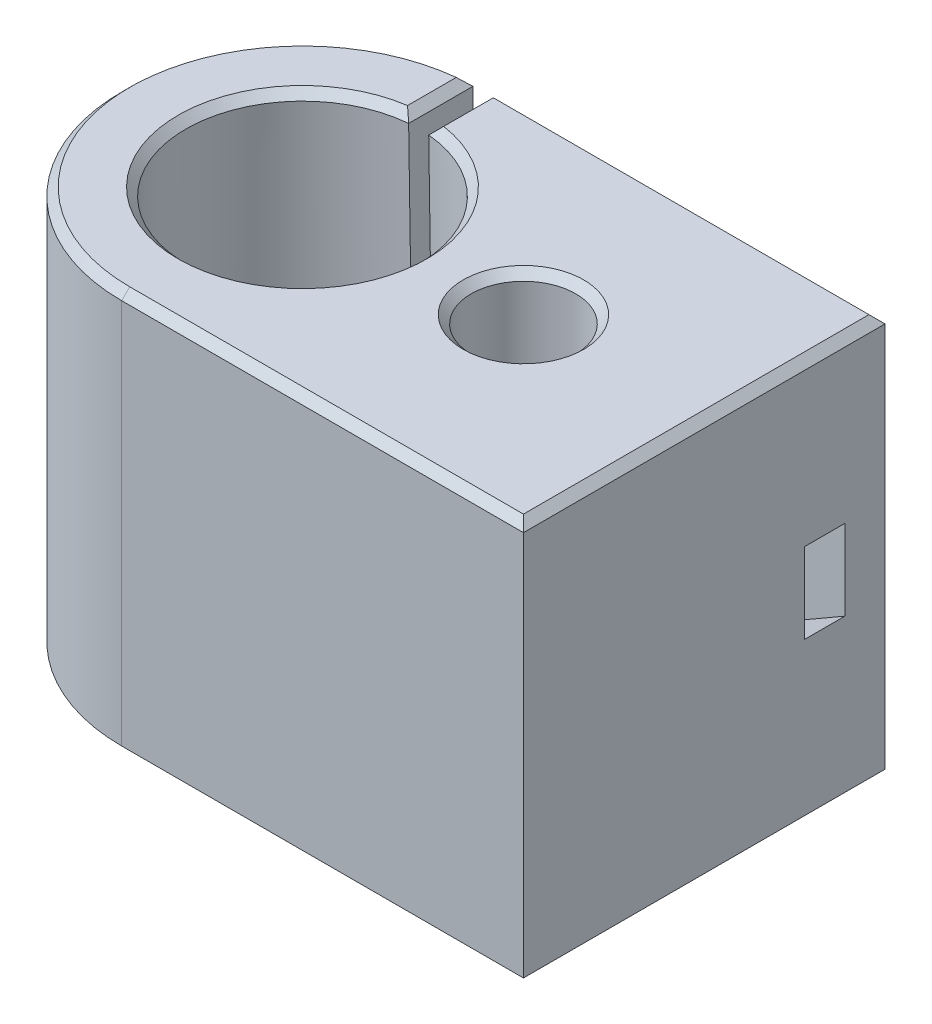
ISO-10303-21;
HEADER;
FILE_DESCRIPTION(('STEP AP214'),'2;1');
FILE_NAME('part.step','',(''),(''),'','','');
FILE_SCHEMA(('AUTOMOTIVE_DESIGN { 1 0 10303 214 1 1 1 1 }'));
ENDSEC;
DATA;
#1=APPLICATION_CONTEXT('core data for automotive mechanical design processes');
#2=APPLICATION_PROTOCOL_DEFINITION('international standard','automotive_design',2000,#1);
#3=PRODUCT_CONTEXT('',#1,'mechanical');
#4=PRODUCT('Part','Part','',(#3));
#5=PRODUCT_RELATED_PRODUCT_CATEGORY('part','',(#4));
#6=PRODUCT_DEFINITION_FORMATION('','',#4);
#7=PRODUCT_DEFINITION_CONTEXT('part definition',#1,'design');
#8=PRODUCT_DEFINITION('design','',#6,#7);
#9=PRODUCT_DEFINITION_SHAPE('','',#8);
#10=(LENGTH_UNIT() NAMED_UNIT(*) SI_UNIT(.MILLI.,.METRE.));
#11=(NAMED_UNIT(*) PLANE_ANGLE_UNIT() SI_UNIT($,.RADIAN.));
#12=(NAMED_UNIT(*) SI_UNIT($,.STERADIAN.) SOLID_ANGLE_UNIT());
#13=UNCERTAINTY_MEASURE_WITH_UNIT(LENGTH_MEASURE(1.E-05),#10,'distance_accuracy_value','');
#14=(GEOMETRIC_REPRESENTATION_CONTEXT(3) GLOBAL_UNCERTAINTY_ASSIGNED_CONTEXT((#13)) GLOBAL_UNIT_ASSIGNED_CONTEXT((#10,
#11,#12)) REPRESENTATION_CONTEXT('',''));
#15=CARTESIAN_POINT('',(0.,0.,0.));
#16=DIRECTION('',(0.,0.,1.));
#17=DIRECTION('',(1.,0.,0.));
#18=AXIS2_PLACEMENT_3D('',#15,#16,#17);
#19=CARTESIAN_POINT('',(0.,20.,0.));
#20=DIRECTION('',(0.,-1.,0.));
#21=DIRECTION('',(0.,0.,-1.));
#22=AXIS2_PLACEMENT_3D('',#19,#20,#21);
#23=CYLINDRICAL_SURFACE('',#22,9.);
#24=DIRECTION('',(0.,-1.,0.));
#25=VECTOR('',#24,1.);
#26=CARTESIAN_POINT('',(-0.5,20.,-8.98610037780572));
#27=LINE('',#26,#25);
#28=CARTESIAN_POINT('',(-0.5,19.6,-8.98610037780572));
#29=VERTEX_POINT('',#28);
#30=CARTESIAN_POINT('',(-0.5,0.400000000000005,-8.98610037780572));
#31=VERTEX_POINT('',#30);
#32=EDGE_CURVE('E208',#29,#31,#27,.T.);
#33=ORIENTED_EDGE('',*,*,#32,.T.);
#34=CARTESIAN_POINT('',(0.,0.400000000000005,0.));
#35=DIRECTION('',(0.,1.,0.));
#36=DIRECTION('',(0.,0.,1.));
#37=AXIS2_PLACEMENT_3D('',#34,#35,#36);
#38=CIRCLE('',#37,9.);
#39=CARTESIAN_POINT('',(0.,0.400000000000005,9.00000000000001));
#40=VERTEX_POINT('',#39);
#41=EDGE_CURVE('E497',#31,#40,#38,.T.);
#42=ORIENTED_EDGE('',*,*,#41,.T.);
#43=DIRECTION('',(0.,-1.,0.));
#44=VECTOR('',#43,1.);
#45=CARTESIAN_POINT('',(0.,20.,9.00000000000001));
#46=LINE('',#45,#44);
#47=CARTESIAN_POINT('',(0.,19.6,9.00000000000001));
#48=VERTEX_POINT('',#47);
#49=EDGE_CURVE('E218',#48,#40,#46,.T.);
#50=ORIENTED_EDGE('',*,*,#49,.F.);
#51=CARTESIAN_POINT('',(0.,19.6,0.));
#52=DIRECTION('',(0.,1.,0.));
#53=DIRECTION('',(0.,0.,1.));
#54=AXIS2_PLACEMENT_3D('',#51,#52,#53);
#55=CIRCLE('',#54,9.);
#56=EDGE_CURVE('E487',#48,#29,#55,.F.);
#57=ORIENTED_EDGE('',*,*,#56,.T.);
#58=EDGE_LOOP('',(#33,#42,#50,#57));
#59=FACE_BOUND('',#58,.T.);
#60=ADVANCED_FACE('F35',(#59),#23,.T.);
#61=CARTESIAN_POINT('',(20.,20.,9.));
#62=DIRECTION('',(0.,0.,-1.));
#63=DIRECTION('',(-1.,0.,0.));
#64=AXIS2_PLACEMENT_3D('',#61,#62,#63);
#65=PLANE('',#64);
#66=ORIENTED_EDGE('',*,*,#49,.T.);
#67=DIRECTION('',(1.,0.,0.));
#68=VECTOR('',#67,1.);
#69=CARTESIAN_POINT('',(20.,0.400000000000005,9.));
#70=LINE('',#69,#68);
#71=CARTESIAN_POINT('',(20.,0.400000000000005,9.));
#72=VERTEX_POINT('',#71);
#73=EDGE_CURVE('E506',#40,#72,#70,.T.);
#74=ORIENTED_EDGE('',*,*,#73,.T.);
#75=DIRECTION('',(0.,-1.,0.));
#76=VECTOR('',#75,1.);
#77=CARTESIAN_POINT('',(20.,20.,9.));
#78=LINE('',#77,#76);
#79=CARTESIAN_POINT('',(20.,19.6,9.));
#80=VERTEX_POINT('',#79);
#81=EDGE_CURVE('E215',#80,#72,#78,.T.);
#82=ORIENTED_EDGE('',*,*,#81,.F.);
#83=DIRECTION('',(-1.,0.,0.));
#84=VECTOR('',#83,1.);
#85=CARTESIAN_POINT('',(0.,19.6,9.00000000000001));
#86=LINE('',#85,#84);
#87=EDGE_CURVE('E489',#80,#48,#86,.T.);
#88=ORIENTED_EDGE('',*,*,#87,.T.);
#89=EDGE_LOOP('',(#66,#74,#82,#88));
#90=FACE_BOUND('',#89,.T.);
#91=ADVANCED_FACE('F428',(#90),#65,.F.);
#92=CARTESIAN_POINT('',(20.,20.,-9.));
#93=DIRECTION('',(-1.,0.,0.));
#94=DIRECTION('',(0.,0.,1.));
#95=AXIS2_PLACEMENT_3D('',#92,#93,#94);
#96=PLANE('',#95);
#97=DIRECTION('',(0.,0.,-1.));
#98=VECTOR('',#97,1.);
#99=CARTESIAN_POINT('',(20.,8.,-5.));
#100=LINE('',#99,#98);
#101=CARTESIAN_POINT('',(20.,8.,-5.));
#102=VERTEX_POINT('',#101);
#103=CARTESIAN_POINT('',(20.,8.,-7.));
#104=VERTEX_POINT('',#103);
#105=EDGE_CURVE('E178',#102,#104,#100,.T.);
#106=ORIENTED_EDGE('',*,*,#105,.F.);
#107=DIRECTION('',(0.,-1.,0.));
#108=VECTOR('',#107,1.);
#109=CARTESIAN_POINT('',(20.,12.,-5.));
#110=LINE('',#109,#108);
#111=CARTESIAN_POINT('',(20.,12.,-5.));
#112=VERTEX_POINT('',#111);
#113=EDGE_CURVE('E185',#112,#102,#110,.T.);
#114=ORIENTED_EDGE('',*,*,#113,.F.);
#115=DIRECTION('',(0.,0.,-1.));
#116=VECTOR('',#115,1.);
#117=CARTESIAN_POINT('',(20.,12.,-5.));
#118=LINE('',#117,#116);
#119=CARTESIAN_POINT('',(20.,12.,-7.));
#120=VERTEX_POINT('',#119);
#121=EDGE_CURVE('E209',#112,#120,#118,.T.);
#122=ORIENTED_EDGE('',*,*,#121,.T.);
#123=DIRECTION('',(0.,-1.,0.));
#124=VECTOR('',#123,1.);
#125=CARTESIAN_POINT('',(20.,12.,-7.));
#126=LINE('',#125,#124);
#127=EDGE_CURVE('E198',#120,#104,#126,.T.);
#128=ORIENTED_EDGE('',*,*,#127,.T.);
#129=EDGE_LOOP('',(#106,#114,#122,#128));
#130=FACE_BOUND('',#129,.T.);
#131=ORIENTED_EDGE('',*,*,#81,.T.);
#132=DIRECTION('',(0.,0.,-1.));
#133=VECTOR('',#132,1.);
#134=CARTESIAN_POINT('',(20.,0.400000000000005,-9.));
#135=LINE('',#134,#133);
#136=CARTESIAN_POINT('',(20.,0.400000000000005,-9.));
#137=VERTEX_POINT('',#136);
#138=EDGE_CURVE('E511',#72,#137,#135,.T.);
#139=ORIENTED_EDGE('',*,*,#138,.T.);
#140=DIRECTION('',(0.,-1.,0.));
#141=VECTOR('',#140,1.);
#142=CARTESIAN_POINT('',(20.,20.,-9.));
#143=LINE('',#142,#141);
#144=CARTESIAN_POINT('',(20.,19.6,-9.));
#145=VERTEX_POINT('',#144);
#146=EDGE_CURVE('E212',#145,#137,#143,.T.);
#147=ORIENTED_EDGE('',*,*,#146,.F.);
#148=DIRECTION('',(0.,0.,1.));
#149=VECTOR('',#148,1.);
#150=CARTESIAN_POINT('',(20.,19.6,9.));
#151=LINE('',#150,#149);
#152=EDGE_CURVE('E476',#145,#80,#151,.T.);
#153=ORIENTED_EDGE('',*,*,#152,.T.);
#154=EDGE_LOOP('',(#131,#139,#147,#153));
#155=FACE_BOUND('',#154,.T.);
#156=ADVANCED_FACE('F196',(#130,#155),#96,.F.);
#157=CARTESIAN_POINT('',(0.,20.,-9.));
#158=DIRECTION('',(0.,0.,1.));
#159=DIRECTION('',(1.,0.,0.));
#160=AXIS2_PLACEMENT_3D('',#157,#158,#159);
#161=PLANE('',#160);
#162=ORIENTED_EDGE('',*,*,#146,.T.);
#163=DIRECTION('',(-1.,0.,0.));
#164=VECTOR('',#163,1.);
#165=CARTESIAN_POINT('',(0.,0.400000000000005,-9.));
#166=LINE('',#165,#164);
#167=CARTESIAN_POINT('',(0.5,0.400000000000001,-9.));
#168=VERTEX_POINT('',#167);
#169=EDGE_CURVE('E513',#137,#168,#166,.T.);
#170=ORIENTED_EDGE('',*,*,#169,.T.);
#171=DIRECTION('',(0.,1.,0.));
#172=VECTOR('',#171,1.);
#173=CARTESIAN_POINT('',(0.5,-9.05538513813741,-9.));
#174=LINE('',#173,#172);
#175=CARTESIAN_POINT('',(0.5,19.6,-9.));
#176=VERTEX_POINT('',#175);
#177=EDGE_CURVE('E205',#168,#176,#174,.T.);
#178=ORIENTED_EDGE('',*,*,#177,.T.);
#179=DIRECTION('',(1.,0.,0.));
#180=VECTOR('',#179,1.);
#181=CARTESIAN_POINT('',(20.,19.6,-9.));
#182=LINE('',#181,#180);
#183=EDGE_CURVE('E258',#176,#145,#182,.T.);
#184=ORIENTED_EDGE('',*,*,#183,.T.);
#185=EDGE_LOOP('',(#162,#170,#178,#184));
#186=FACE_BOUND('',#185,.T.);
#187=ADVANCED_FACE('F438',(#186),#161,.F.);
#188=CARTESIAN_POINT('',(0.,20.,0.));
#189=DIRECTION('',(0.,1.,0.));
#190=DIRECTION('',(0.,0.,1.));
#191=AXIS2_PLACEMENT_3D('',#188,#189,#190);
#192=PLANE('',#191);
#193=DIRECTION('',(0.,0.,1.));
#194=VECTOR('',#193,1.);
#195=CARTESIAN_POINT('',(0.900000000000004,20.,-5.77840808527747));
#196=LINE('',#195,#194);
#197=CARTESIAN_POINT('',(0.900000000000004,20.,-8.6));
#198=VERTEX_POINT('',#197);
#199=CARTESIAN_POINT('',(0.900000000000004,20.,-6.12839976272959));
#200=VERTEX_POINT('',#199);
#201=EDGE_CURVE('E45',#198,#200,#196,.T.);
#202=ORIENTED_EDGE('',*,*,#201,.T.);
#203=CARTESIAN_POINT('',(0.,20.,0.));
#204=DIRECTION('',(0.,1.,0.));
#205=DIRECTION('',(0.,0.,1.));
#206=AXIS2_PLACEMENT_3D('',#203,#204,#205);
#207=CIRCLE('',#206,6.19413300243255);
#208=CARTESIAN_POINT('',(-0.900000000000004,20.,-6.12839976272959));
#209=VERTEX_POINT('',#208);
#210=EDGE_CURVE('E11',#200,#209,#207,.F.);
#211=ORIENTED_EDGE('',*,*,#210,.T.);
#212=DIRECTION('',(0.,0.,-1.));
#213=VECTOR('',#212,1.);
#214=CARTESIAN_POINT('',(-0.900000000000004,20.,-8.98610037780572));
#215=LINE('',#214,#213);
#216=CARTESIAN_POINT('',(-0.900000000000004,20.,-8.55277732669336));
#217=VERTEX_POINT('',#216);
#218=EDGE_CURVE('E363',#209,#217,#215,.T.);
#219=ORIENTED_EDGE('',*,*,#218,.T.);
#220=CARTESIAN_POINT('',(0.,20.,0.));
#221=DIRECTION('',(0.,1.,0.));
#222=DIRECTION('',(0.,0.,1.));
#223=AXIS2_PLACEMENT_3D('',#220,#221,#222);
#224=CIRCLE('',#223,8.6);
#225=CARTESIAN_POINT('',(0.,20.,8.6));
#226=VERTEX_POINT('',#225);
#227=EDGE_CURVE('E456',#217,#226,#224,.T.);
#228=ORIENTED_EDGE('',*,*,#227,.T.);
#229=DIRECTION('',(1.,0.,0.));
#230=VECTOR('',#229,1.);
#231=CARTESIAN_POINT('',(20.,20.,8.59999999999999));
#232=LINE('',#231,#230);
#233=CARTESIAN_POINT('',(19.6,20.,8.59999999999999));
#234=VERTEX_POINT('',#233);
#235=EDGE_CURVE('E464',#226,#234,#232,.T.);
#236=ORIENTED_EDGE('',*,*,#235,.T.);
#237=DIRECTION('',(0.,0.,-1.));
#238=VECTOR('',#237,1.);
#239=CARTESIAN_POINT('',(19.6,20.,-9.));
#240=LINE('',#239,#238);
#241=CARTESIAN_POINT('',(19.6,20.,-8.59999999999999));
#242=VERTEX_POINT('',#241);
#243=EDGE_CURVE('E466',#234,#242,#240,.T.);
#244=ORIENTED_EDGE('',*,*,#243,.T.);
#245=DIRECTION('',(-1.,0.,0.));
#246=VECTOR('',#245,1.);
#247=CARTESIAN_POINT('',(0.5,20.,-8.6));
#248=LINE('',#247,#246);
#249=EDGE_CURVE('E56',#242,#198,#248,.T.);
#250=ORIENTED_EDGE('',*,*,#249,.T.);
#251=EDGE_LOOP('',(#202,#211,#219,#228,#236,#244,#250));
#252=FACE_BOUND('',#251,.T.);
#253=CARTESIAN_POINT('',(11.,20.,0.));
#254=DIRECTION('',(0.,1.,0.));
#255=DIRECTION('',(0.,0.,1.));
#256=AXIS2_PLACEMENT_3D('',#253,#254,#255);
#257=CIRCLE('',#256,3.);
#258=CARTESIAN_POINT('',(11.,20.,3.));
#259=VERTEX_POINT('',#258);
#260=EDGE_CURVE('E452',#259,#259,#257,.F.);
#261=ORIENTED_EDGE('',*,*,#260,.T.);
#262=EDGE_LOOP('',(#261));
#263=FACE_BOUND('',#262,.T.);
#264=ADVANCED_FACE('F441',(#252,#263),#192,.T.);
#265=CARTESIAN_POINT('',(0.,0.,0.));
#266=DIRECTION('',(0.,1.,0.));
#267=DIRECTION('',(0.,0.,1.));
#268=AXIS2_PLACEMENT_3D('',#265,#266,#267);
#269=PLANE('',#268);
#270=DIRECTION('',(0.,0.,1.));
#271=VECTOR('',#270,1.);
#272=CARTESIAN_POINT('',(-0.900000000000005,0.,0.));
#273=LINE('',#272,#271);
#274=CARTESIAN_POINT('',(-0.900000000000006,0.,-8.55277732669335));
#275=VERTEX_POINT('',#274);
#276=CARTESIAN_POINT('',(-0.900000000000005,0.,-6.43739077577248));
#277=VERTEX_POINT('',#276);
#278=EDGE_CURVE('E311',#275,#277,#273,.T.);
#279=ORIENTED_EDGE('',*,*,#278,.T.);
#280=CARTESIAN_POINT('',(0.,0.,0.));
#281=DIRECTION('',(0.,1.,0.));
#282=DIRECTION('',(0.,0.,1.));
#283=AXIS2_PLACEMENT_3D('',#280,#281,#282);
#284=CIRCLE('',#283,6.50000000000009);
#285=CARTESIAN_POINT('',(0.900000000000005,0.,-6.43739077577248));
#286=VERTEX_POINT('',#285);
#287=EDGE_CURVE('E321',#277,#286,#284,.T.);
#288=ORIENTED_EDGE('',*,*,#287,.T.);
#289=DIRECTION('',(0.,0.,-1.));
#290=VECTOR('',#289,1.);
#291=CARTESIAN_POINT('',(0.900000000000005,0.,0.));
#292=LINE('',#291,#290);
#293=CARTESIAN_POINT('',(0.900000000000006,0.,-8.59999999999999));
#294=VERTEX_POINT('',#293);
#295=EDGE_CURVE('E319',#286,#294,#292,.T.);
#296=ORIENTED_EDGE('',*,*,#295,.T.);
#297=DIRECTION('',(1.,0.,0.));
#298=VECTOR('',#297,1.);
#299=CARTESIAN_POINT('',(0.,0.,-8.59999999999999));
#300=LINE('',#299,#298);
#301=CARTESIAN_POINT('',(19.6,0.,-8.59999999999999));
#302=VERTEX_POINT('',#301);
#303=EDGE_CURVE('E317',#294,#302,#300,.T.);
#304=ORIENTED_EDGE('',*,*,#303,.T.);
#305=DIRECTION('',(0.,0.,1.));
#306=VECTOR('',#305,1.);
#307=CARTESIAN_POINT('',(19.6,0.,0.));
#308=LINE('',#307,#306);
#309=CARTESIAN_POINT('',(19.6,0.,8.59999999999999));
#310=VERTEX_POINT('',#309);
#311=EDGE_CURVE('E315',#302,#310,#308,.T.);
#312=ORIENTED_EDGE('',*,*,#311,.T.);
#313=DIRECTION('',(-1.,0.,0.));
#314=VECTOR('',#313,1.);
#315=CARTESIAN_POINT('',(0.,0.,8.6));
#316=LINE('',#315,#314);
#317=CARTESIAN_POINT('',(0.,0.,8.6));
#318=VERTEX_POINT('',#317);
#319=EDGE_CURVE('E313',#310,#318,#316,.T.);
#320=ORIENTED_EDGE('',*,*,#319,.T.);
#321=CARTESIAN_POINT('',(0.,0.,0.));
#322=DIRECTION('',(0.,1.,0.));
#323=DIRECTION('',(0.,0.,1.));
#324=AXIS2_PLACEMENT_3D('',#321,#322,#323);
#325=CIRCLE('',#324,8.6);
#326=EDGE_CURVE('E309',#318,#275,#325,.F.);
#327=ORIENTED_EDGE('',*,*,#326,.T.);
#328=EDGE_LOOP('',(#279,#288,#296,#304,#312,#320,#327));
#329=FACE_BOUND('',#328,.T.);
#330=CARTESIAN_POINT('',(11.,0.,0.));
#331=DIRECTION('',(0.,1.,0.));
#332=DIRECTION('',(0.,0.,1.));
#333=AXIS2_PLACEMENT_3D('',#330,#331,#332);
#334=CIRCLE('',#333,3.00000000000001);
#335=CARTESIAN_POINT('',(11.,0.,3.00000000000001));
#336=VERTEX_POINT('',#335);
#337=EDGE_CURVE('E304',#336,#336,#334,.T.);
#338=ORIENTED_EDGE('',*,*,#337,.T.);
#339=EDGE_LOOP('',(#338));
#340=FACE_BOUND('',#339,.T.);
#341=ADVANCED_FACE('F443',(#329,#340),#269,.F.);
#342=CARTESIAN_POINT('',(0.,20.,0.));
#343=DIRECTION('',(0.,-1.,0.));
#344=DIRECTION('',(1.,0.,0.));
#345=AXIS2_PLACEMENT_3D('',#342,#343,#344);
#346=CONICAL_SURFACE('',#345,5.8,0.0149988751518525);
#347=CARTESIAN_POINT('',(0.5,-20.9097671882514,-6.39412711222737));
#348=CARTESIAN_POINT('',(0.5,-16.6976612000782,-6.330753652525));
#349=CARTESIAN_POINT('',(0.5,-12.4855553158357,-6.26737328767739));
#350=CARTESIAN_POINT('',(0.5,8.12095761354692,-5.95726934756004));
#351=CARTESIAN_POINT('',(0.5,24.5153631881387,-5.71044806923976));
#352=CARTESIAN_POINT('',(0.5,40.9097671882514,-5.46352218272369));
#353=B_SPLINE_CURVE_WITH_KNOTS('',3,(#347,#348,#349,#350,#351,#352),.UNSPECIFIED.,.F.,.F.,(4,2,
4),(0.,12.6377481165144,61.8265384450918),.UNSPECIFIED.);
#354=CARTESIAN_POINT('',(0.5,0.406091370558403,-6.07336170370114));
#355=VERTEX_POINT('',#354);
#356=CARTESIAN_POINT('',(0.5,19.6,-5.78443048190572));
#357=VERTEX_POINT('',#356);
#358=EDGE_CURVE('E221',#355,#357,#353,.T.);
#359=ORIENTED_EDGE('',*,*,#358,.F.);
#360=CARTESIAN_POINT('',(0.,0.406091370558403,0.));
#361=DIRECTION('',(0.,-1.,0.));
#362=DIRECTION('',(1.,0.,0.));
#363=AXIS2_PLACEMENT_3D('',#360,#361,#362);
#364=CIRCLE('',#363,6.09390862944166);
#365=CARTESIAN_POINT('',(-0.5,0.406091370558384,-6.07336170370113));
#366=VERTEX_POINT('',#365);
#367=EDGE_CURVE('E338',#355,#366,#364,.T.);
#368=ORIENTED_EDGE('',*,*,#367,.T.);
#369=CARTESIAN_POINT('',(-0.5,40.9097671882514,-5.4635221827237));
#370=CARTESIAN_POINT('',(-0.5,37.3066536672766,-5.51779461601208));
#371=CARTESIAN_POINT('',(-0.5,33.7035400477636,-5.57206050733234));
#372=CARTESIAN_POINT('',(-0.5,15.6879714899711,-5.8433594204811));
#373=CARTESIAN_POINT('',(-0.5,1.27551517174771,-6.06030081194087));
#374=CARTESIAN_POINT('',(-0.5,-15.7278838293445,-6.31615937561582));
#375=CARTESIAN_POINT('',(-0.5,-18.3188254929948,-6.35514429463713));
#376=CARTESIAN_POINT('',(-0.5,-20.9097671882514,-6.39412711222736));
#377=B_SPLINE_CURVE_WITH_KNOTS('',3,(#369,#370,#371,#372,#373,#374,#375,#376),.UNSPECIFIED.,.F.,
.F.,(4,2,2,4),(0.,10.8105667232747,54.0528336171118,61.8265384452501),.UNSPECIFIED.);
#378=CARTESIAN_POINT('',(-0.5,19.6,-5.78443048190572));
#379=VERTEX_POINT('',#378);
#380=EDGE_CURVE('E230',#379,#366,#377,.T.);
#381=ORIENTED_EDGE('',*,*,#380,.F.);
#382=CARTESIAN_POINT('',(0.0872221249781363,19.0127778750219,0.));
#383=DIRECTION('',(0.707106781186548,0.707106781186547,0.));
#384=DIRECTION('',(0.707106781186547,-0.707106781186548,0.));
#385=AXIS2_PLACEMENT_3D('',#382,#383,#384);
#386=ELLIPSE('',#385,8.22338080553726,5.81415412913637);
#387=CARTESIAN_POINT('',(-0.500044992407677,19.6000449924077,-5.78442591523056));
#388=VERTEX_POINT('',#387);
#389=EDGE_CURVE('E350',#379,#388,#386,.T.);
#390=ORIENTED_EDGE('',*,*,#389,.T.);
#391=CARTESIAN_POINT('',(0.,19.6000449924077,0.));
#392=DIRECTION('',(0.,1.,0.));
#393=DIRECTION('',(0.,0.,1.));
#394=AXIS2_PLACEMENT_3D('',#391,#392,#393);
#395=CIRCLE('',#394,5.80599932511389);
#396=CARTESIAN_POINT('',(0.500044992407677,19.6000449924077,-5.78442591523056));
#397=VERTEX_POINT('',#396);
#398=EDGE_CURVE('E346',#388,#397,#395,.T.);
#399=ORIENTED_EDGE('',*,*,#398,.T.);
#400=CARTESIAN_POINT('',(-0.0872221249781266,19.0127778750219,0.));
#401=DIRECTION('',(-0.707106781186548,0.707106781186547,0.));
#402=DIRECTION('',(-0.707106781186547,-0.707106781186548,0.));
#403=AXIS2_PLACEMENT_3D('',#400,#401,#402);
#404=ELLIPSE('',#403,8.22338080553723,5.81415412913637);
#405=EDGE_CURVE('E344',#397,#357,#404,.T.);
#406=ORIENTED_EDGE('',*,*,#405,.T.);
#407=EDGE_LOOP('',(#359,#368,#381,#390,#399,#406));
#408=FACE_BOUND('',#407,.T.);
#409=ADVANCED_FACE('F237',(#408),#346,.F.);
#410=CARTESIAN_POINT('',(0.5,-9.05538513813741,-9.));
#411=DIRECTION('',(1.,0.,0.));
#412=DIRECTION('',(0.,0.,-1.));
#413=AXIS2_PLACEMENT_3D('',#410,#411,#412);
#414=PLANE('',#413);
#415=DIRECTION('',(0.,0.,1.));
#416=VECTOR('',#415,1.);
#417=CARTESIAN_POINT('',(0.5,0.400000000000005,-9.));
#418=LINE('',#417,#416);
#419=CARTESIAN_POINT('',(0.5,0.400000000000005,-6.07947366142831));
#420=VERTEX_POINT('',#419);
#421=EDGE_CURVE('E259',#168,#420,#418,.T.);
#422=ORIENTED_EDGE('',*,*,#421,.T.);
#423=CARTESIAN_POINT('',(0.5,0.400000000000005,-6.07947366142831));
#424=CARTESIAN_POINT('',(0.5,0.401015230149117,-6.07845500352403));
#425=CARTESIAN_POINT('',(0.5,0.402030459436873,-6.07743634476129));
#426=CARTESIAN_POINT('',(0.5,0.404060916289667,-6.0753990255189));
#427=CARTESIAN_POINT('',(0.5,0.405076143854707,-6.07438036503925));
#428=CARTESIAN_POINT('',(0.5,0.406091370558388,-6.07336170370114));
#429=B_SPLINE_CURVE_WITH_KNOTS('',3,(#423,#424,#425,#426,#427,#428),.UNSPECIFIED.,.F.,.F.,(4,2,
4),(0.,0.00431453423147752,0.00862906846295526),.UNSPECIFIED.);
#430=EDGE_CURVE('E250',#420,#355,#429,.T.);
#431=ORIENTED_EDGE('',*,*,#430,.T.);
#432=ORIENTED_EDGE('',*,*,#358,.T.);
#433=DIRECTION('',(0.,0.,-1.));
#434=VECTOR('',#433,1.);
#435=CARTESIAN_POINT('',(0.5,19.6,-9.));
#436=LINE('',#435,#434);
#437=EDGE_CURVE('E323',#357,#176,#436,.T.);
#438=ORIENTED_EDGE('',*,*,#437,.T.);
#439=ORIENTED_EDGE('',*,*,#177,.F.);
#440=EDGE_LOOP('',(#422,#431,#432,#438,#439));
#441=FACE_BOUND('',#440,.T.);
#442=ADVANCED_FACE('F240',(#441),#414,.F.);
#443=CARTESIAN_POINT('',(-0.5,-9.05538513813741,-9.));
#444=DIRECTION('',(-1.,0.,0.));
#445=DIRECTION('',(0.,0.,1.));
#446=AXIS2_PLACEMENT_3D('',#443,#444,#445);
#447=PLANE('',#446);
#448=ORIENTED_EDGE('',*,*,#380,.T.);
#449=CARTESIAN_POINT('',(-0.5,0.406091370558392,-6.07336170370113));
#450=CARTESIAN_POINT('',(-0.5,0.405076143854709,-6.07438036503924));
#451=CARTESIAN_POINT('',(-0.5,0.404060916289669,-6.0753990255189));
#452=CARTESIAN_POINT('',(-0.5,0.402030459436874,-6.07743634476129));
#453=CARTESIAN_POINT('',(-0.5,0.401015230149118,-6.07845500352403));
#454=CARTESIAN_POINT('',(-0.5,0.400000000000005,-6.07947366142831));
#455=B_SPLINE_CURVE_WITH_KNOTS('',3,(#449,#450,#451,#452,#453,#454),.UNSPECIFIED.,.F.,.F.,(4,2,
4),(0.,0.00431453423148008,0.00862906846295975),.UNSPECIFIED.);
#456=CARTESIAN_POINT('',(-0.5,0.400000000000005,-6.07947366142831));
#457=VERTEX_POINT('',#456);
#458=EDGE_CURVE('E297',#366,#457,#455,.T.);
#459=ORIENTED_EDGE('',*,*,#458,.T.);
#460=DIRECTION('',(0.,0.,-1.));
#461=VECTOR('',#460,1.);
#462=CARTESIAN_POINT('',(-0.5,0.400000000000005,-9.));
#463=LINE('',#462,#461);
#464=EDGE_CURVE('E305',#457,#31,#463,.T.);
#465=ORIENTED_EDGE('',*,*,#464,.T.);
#466=ORIENTED_EDGE('',*,*,#32,.F.);
#467=DIRECTION('',(0.,0.,1.));
#468=VECTOR('',#467,1.);
#469=CARTESIAN_POINT('',(-0.5,19.6,-5.77840808527747));
#470=LINE('',#469,#468);
#471=EDGE_CURVE('E343',#29,#379,#470,.T.);
#472=ORIENTED_EDGE('',*,*,#471,.T.);
#473=EDGE_LOOP('',(#448,#459,#465,#466,#472));
#474=FACE_BOUND('',#473,.T.);
#475=ADVANCED_FACE('F244',(#474),#447,.F.);
#476=CARTESIAN_POINT('',(20.,12.,-5.));
#477=DIRECTION('',(0.499999999999995,0.866025403784441,0.));
#478=DIRECTION('',(-0.866025403784442,0.499999999999995,0.));
#479=AXIS2_PLACEMENT_3D('',#476,#477,#478);
#480=PLANE('',#479);
#481=DIRECTION('',(0.866025403784442,-0.499999999999995,0.));
#482=VECTOR('',#481,1.);
#483=CARTESIAN_POINT('',(20.,12.,-7.));
#484=LINE('',#483,#482);
#485=CARTESIAN_POINT('',(14.,15.4641016151377,-7.));
#486=VERTEX_POINT('',#485);
#487=EDGE_CURVE('E194',#486,#120,#484,.T.);
#488=ORIENTED_EDGE('',*,*,#487,.T.);
#489=ORIENTED_EDGE('',*,*,#121,.F.);
#490=DIRECTION('',(0.866025403784442,-0.499999999999995,0.));
#491=VECTOR('',#490,1.);
#492=CARTESIAN_POINT('',(20.,12.,-5.));
#493=LINE('',#492,#491);
#494=CARTESIAN_POINT('',(14.,15.4641016151377,-5.));
#495=VERTEX_POINT('',#494);
#496=EDGE_CURVE('E191',#495,#112,#493,.T.);
#497=ORIENTED_EDGE('',*,*,#496,.F.);
#498=DIRECTION('',(0.,0.,-1.));
#499=VECTOR('',#498,1.);
#500=CARTESIAN_POINT('',(14.,15.4641016151377,-5.));
#501=LINE('',#500,#499);
#502=EDGE_CURVE('E200',#495,#486,#501,.T.);
#503=ORIENTED_EDGE('',*,*,#502,.T.);
#504=EDGE_LOOP('',(#488,#489,#497,#503));
#505=FACE_BOUND('',#504,.T.);
#506=ADVANCED_FACE('F666',(#505),#480,.F.);
#507=CARTESIAN_POINT('',(14.,4.53589838486224,-5.));
#508=DIRECTION('',(-1.,0.,0.));
#509=DIRECTION('',(0.,0.,1.));
#510=AXIS2_PLACEMENT_3D('',#507,#508,#509);
#511=PLANE('',#510);
#512=DIRECTION('',(0.,1.,0.));
#513=VECTOR('',#512,1.);
#514=CARTESIAN_POINT('',(14.,4.53589838486224,-7.));
#515=LINE('',#514,#513);
#516=CARTESIAN_POINT('',(14.,4.53589838486224,-7.));
#517=VERTEX_POINT('',#516);
#518=EDGE_CURVE('E758',#517,#486,#515,.T.);
#519=ORIENTED_EDGE('',*,*,#518,.T.);
#520=ORIENTED_EDGE('',*,*,#502,.F.);
#521=DIRECTION('',(0.,1.,0.));
#522=VECTOR('',#521,1.);
#523=CARTESIAN_POINT('',(14.,4.53589838486224,-5.));
#524=LINE('',#523,#522);
#525=CARTESIAN_POINT('',(14.,4.53589838486224,-5.));
#526=VERTEX_POINT('',#525);
#527=EDGE_CURVE('E184',#526,#495,#524,.T.);
#528=ORIENTED_EDGE('',*,*,#527,.F.);
#529=DIRECTION('',(0.,0.,-1.));
#530=VECTOR('',#529,1.);
#531=CARTESIAN_POINT('',(14.,4.53589838486224,-5.));
#532=LINE('',#531,#530);
#533=EDGE_CURVE('E180',#526,#517,#532,.T.);
#534=ORIENTED_EDGE('',*,*,#533,.T.);
#535=EDGE_LOOP('',(#519,#520,#528,#534));
#536=FACE_BOUND('',#535,.T.);
#537=ADVANCED_FACE('F736',(#536),#511,.F.);
#538=CARTESIAN_POINT('',(14.,4.53589838486224,-5.));
#539=DIRECTION('',(0.500000000000001,-0.866025403784438,0.));
#540=DIRECTION('',(0.866025403784438,0.500000000000001,0.));
#541=AXIS2_PLACEMENT_3D('',#538,#539,#540);
#542=PLANE('',#541);
#543=DIRECTION('',(-0.866025403784438,-0.500000000000001,0.));
#544=VECTOR('',#543,1.);
#545=CARTESIAN_POINT('',(14.,4.53589838486224,-7.));
#546=LINE('',#545,#544);
#547=EDGE_CURVE('E530',#104,#517,#546,.T.);
#548=ORIENTED_EDGE('',*,*,#547,.T.);
#549=ORIENTED_EDGE('',*,*,#533,.F.);
#550=DIRECTION('',(-0.866025403784438,-0.500000000000001,0.));
#551=VECTOR('',#550,1.);
#552=CARTESIAN_POINT('',(14.,4.53589838486224,-5.));
#553=LINE('',#552,#551);
#554=EDGE_CURVE('E173',#102,#526,#553,.T.);
#555=ORIENTED_EDGE('',*,*,#554,.F.);
#556=ORIENTED_EDGE('',*,*,#105,.T.);
#557=EDGE_LOOP('',(#548,#549,#555,#556));
#558=FACE_BOUND('',#557,.T.);
#559=ADVANCED_FACE('F176',(#558),#542,.F.);
#560=CARTESIAN_POINT('',(0.,0.,-5.));
#561=DIRECTION('',(0.,0.,1.));
#562=DIRECTION('',(1.,0.,0.));
#563=AXIS2_PLACEMENT_3D('',#560,#561,#562);
#564=PLANE('',#563);
#565=ORIENTED_EDGE('',*,*,#113,.T.);
#566=ORIENTED_EDGE('',*,*,#554,.T.);
#567=ORIENTED_EDGE('',*,*,#527,.T.);
#568=ORIENTED_EDGE('',*,*,#496,.T.);
#569=EDGE_LOOP('',(#565,#566,#567,#568));
#570=FACE_BOUND('',#569,.T.);
#571=ADVANCED_FACE('F189',(#570),#564,.F.);
#572=CARTESIAN_POINT('',(0.,0.,-7.));
#573=DIRECTION('',(0.,0.,1.));
#574=DIRECTION('',(1.,0.,0.));
#575=AXIS2_PLACEMENT_3D('',#572,#573,#574);
#576=PLANE('',#575);
#577=ORIENTED_EDGE('',*,*,#127,.F.);
#578=ORIENTED_EDGE('',*,*,#487,.F.);
#579=ORIENTED_EDGE('',*,*,#518,.F.);
#580=ORIENTED_EDGE('',*,*,#547,.F.);
#581=EDGE_LOOP('',(#577,#578,#579,#580));
#582=FACE_BOUND('',#581,.T.);
#583=ADVANCED_FACE('F654',(#582),#576,.T.);
#584=CARTESIAN_POINT('',(11.,-7.35391052434009,0.));
#585=DIRECTION('',(0.,1.,0.));
#586=DIRECTION('',(0.,0.,1.));
#587=AXIS2_PLACEMENT_3D('',#584,#585,#586);
#588=CYLINDRICAL_SURFACE('',#587,2.6);
#589=CARTESIAN_POINT('',(11.,0.400000000000008,0.));
#590=DIRECTION('',(0.,1.,0.));
#591=DIRECTION('',(0.,0.,1.));
#592=AXIS2_PLACEMENT_3D('',#589,#590,#591);
#593=CIRCLE('',#592,2.6);
#594=CARTESIAN_POINT('',(11.,0.400000000000008,2.6));
#595=VERTEX_POINT('',#594);
#596=EDGE_CURVE('E454',#595,#595,#593,.F.);
#597=ORIENTED_EDGE('',*,*,#596,.T.);
#598=EDGE_LOOP('',(#597));
#599=FACE_BOUND('',#598,.T.);
#600=CARTESIAN_POINT('',(11.,19.6,0.));
#601=DIRECTION('',(0.,1.,0.));
#602=DIRECTION('',(0.,0.,1.));
#603=AXIS2_PLACEMENT_3D('',#600,#601,#602);
#604=CIRCLE('',#603,2.6);
#605=CARTESIAN_POINT('',(11.,19.6,2.6));
#606=VERTEX_POINT('',#605);
#607=EDGE_CURVE('E459',#606,#606,#604,.T.);
#608=ORIENTED_EDGE('',*,*,#607,.T.);
#609=EDGE_LOOP('',(#608));
#610=FACE_BOUND('',#609,.T.);
#611=ADVANCED_FACE('F562',(#599,#610),#588,.F.);
#612=CARTESIAN_POINT('',(20.,0.400000000000005,-9.));
#613=DIRECTION('',(-0.707106781186546,0.707106781186549,0.));
#614=DIRECTION('',(0.,0.,-1.));
#615=AXIS2_PLACEMENT_3D('',#612,#613,#614);
#616=PLANE('',#615);
#617=DIRECTION('',(0.577350269189626,0.577350269189623,-0.577350269189628));
#618=VECTOR('',#617,1.);
#619=CARTESIAN_POINT('',(20.,0.400000000000005,-9.));
#620=LINE('',#619,#618);
#621=EDGE_CURVE('E526',#137,#302,#620,.F.);
#622=ORIENTED_EDGE('',*,*,#621,.F.);
#623=ORIENTED_EDGE('',*,*,#138,.F.);
#624=DIRECTION('',(0.577350269189627,0.577350269189624,0.577350269189626));
#625=VECTOR('',#624,1.);
#626=CARTESIAN_POINT('',(20.,0.400000000000005,9.));
#627=LINE('',#626,#625);
#628=EDGE_CURVE('E371',#310,#72,#627,.T.);
#629=ORIENTED_EDGE('',*,*,#628,.F.);
#630=ORIENTED_EDGE('',*,*,#311,.F.);
#631=EDGE_LOOP('',(#622,#623,#629,#630));
#632=FACE_BOUND('',#631,.T.);
#633=ADVANCED_FACE('F522',(#632),#616,.F.);
#634=CARTESIAN_POINT('',(20.,0.400000000000005,9.));
#635=DIRECTION('',(0.,0.707106781186549,-0.707106781186546));
#636=DIRECTION('',(1.,0.,0.));
#637=AXIS2_PLACEMENT_3D('',#634,#635,#636);
#638=PLANE('',#637);
#639=ORIENTED_EDGE('',*,*,#628,.T.);
#640=ORIENTED_EDGE('',*,*,#73,.F.);
#641=DIRECTION('',(0.,0.707106781186546,0.707106781186549));
#642=VECTOR('',#641,1.);
#643=CARTESIAN_POINT('',(0.,0.,8.6));
#644=LINE('',#643,#642);
#645=EDGE_CURVE('E503',#318,#40,#644,.T.);
#646=ORIENTED_EDGE('',*,*,#645,.F.);
#647=ORIENTED_EDGE('',*,*,#319,.F.);
#648=EDGE_LOOP('',(#639,#640,#646,#647));
#649=FACE_BOUND('',#648,.T.);
#650=ADVANCED_FACE('F529',(#649),#638,.F.);
#651=CARTESIAN_POINT('',(0.,0.400000000000005,-9.));
#652=DIRECTION('',(0.,0.707106781186551,0.707106781186544));
#653=DIRECTION('',(-1.,0.,0.));
#654=AXIS2_PLACEMENT_3D('',#651,#652,#653);
#655=PLANE('',#654);
#656=ORIENTED_EDGE('',*,*,#621,.T.);
#657=ORIENTED_EDGE('',*,*,#303,.F.);
#658=DIRECTION('',(-0.577350269189625,0.577350269189623,-0.577350269189629));
#659=VECTOR('',#658,1.);
#660=CARTESIAN_POINT('',(0.333333333333334,0.56666666666667,-9.16666666666667));
#661=LINE('',#660,#659);
#662=EDGE_CURVE('E534',#168,#294,#661,.F.);
#663=ORIENTED_EDGE('',*,*,#662,.F.);
#664=ORIENTED_EDGE('',*,*,#169,.F.);
#665=EDGE_LOOP('',(#656,#657,#663,#664));
#666=FACE_BOUND('',#665,.T.);
#667=ADVANCED_FACE('F548',(#666),#655,.F.);
#668=CARTESIAN_POINT('',(0.,0.400000000000005,0.));
#669=DIRECTION('',(0.,1.,0.));
#670=DIRECTION('',(0.,0.,1.));
#671=AXIS2_PLACEMENT_3D('',#668,#669,#670);
#672=CONICAL_SURFACE('',#671,9.,0.78539816339745);
#673=ORIENTED_EDGE('',*,*,#645,.T.);
#674=ORIENTED_EDGE('',*,*,#41,.F.);
#675=CARTESIAN_POINT('',(-0.5,0.400000000000005,-8.98610037780572));
#676=CARTESIAN_POINT('',(-0.567275658038891,0.332724341961114,-8.91500434561877));
#677=CARTESIAN_POINT('',(-0.634246793691588,0.265753206308417,-8.84334610491149));
#678=CARTESIAN_POINT('',(-0.767580128009613,0.132419871990392,-8.69890508969197));
#679=CARTESIAN_POINT('',(-0.833942325690252,0.066057674309754,-8.62612231336179));
#680=CARTESIAN_POINT('',(-0.900000000000006,0.,-8.55277732669335));
#681=B_SPLINE_CURVE_WITH_KNOTS('',3,(#675,#676,#677,#678,#679,#680),.UNSPECIFIED.,.F.,.F.,(4,2,
4),(0.,0.356295558970876,0.712591693992063),.UNSPECIFIED.);
#682=EDGE_CURVE('E335',#275,#31,#681,.F.);
#683=ORIENTED_EDGE('',*,*,#682,.F.);
#684=ORIENTED_EDGE('',*,*,#326,.F.);
#685=EDGE_LOOP('',(#673,#674,#683,#684));
#686=FACE_BOUND('',#685,.T.);
#687=ADVANCED_FACE('F500',(#686),#672,.T.);
#688=CARTESIAN_POINT('',(0.5,0.400000000000005,-9.));
#689=DIRECTION('',(0.707106781186547,0.707106781186549,0.));
#690=DIRECTION('',(0.,0.,1.));
#691=AXIS2_PLACEMENT_3D('',#688,#689,#690);
#692=PLANE('',#691);
#693=ORIENTED_EDGE('',*,*,#662,.T.);
#694=ORIENTED_EDGE('',*,*,#295,.F.);
#695=CARTESIAN_POINT('',(0.900000000000005,0.,-6.43739077577248));
#696=CARTESIAN_POINT('',(0.832788498510327,0.0672115014896781,-6.37895598983418));
#697=CARTESIAN_POINT('',(0.765849458240734,0.134150541759272,-6.3199122109993));
#698=CARTESIAN_POINT('',(0.632516123463252,0.267483876536753,-6.2006065094458));
#699=CARTESIAN_POINT('',(0.566121830399509,0.333878169600496,-6.14034458349929));
#700=CARTESIAN_POINT('',(0.499999999999995,0.400000000000009,-6.07947366142832));
#701=B_SPLINE_CURVE_WITH_KNOTS('',3,(#695,#696,#697,#698,#699,#700),.UNSPECIFIED.,.F.,.F.,(4,2,
4),(0.,0.334709638928686,0.669420164898308),.UNSPECIFIED.);
#702=EDGE_CURVE('E290',#420,#286,#701,.F.);
#703=ORIENTED_EDGE('',*,*,#702,.F.);
#704=ORIENTED_EDGE('',*,*,#421,.F.);
#705=EDGE_LOOP('',(#693,#694,#703,#704));
#706=FACE_BOUND('',#705,.T.);
#707=ADVANCED_FACE('F277',(#706),#692,.F.);
#708=CARTESIAN_POINT('',(-0.5,0.400000000000005,-9.));
#709=DIRECTION('',(-0.707106781186547,0.707106781186549,0.));
#710=DIRECTION('',(0.,0.,-1.));
#711=AXIS2_PLACEMENT_3D('',#708,#709,#710);
#712=PLANE('',#711);
#713=ORIENTED_EDGE('',*,*,#682,.T.);
#714=ORIENTED_EDGE('',*,*,#464,.F.);
#715=CARTESIAN_POINT('',(-0.5,0.400000000000005,-6.07947366142831));
#716=CARTESIAN_POINT('',(-0.566121830399513,0.333878169600492,-6.14034458349928));
#717=CARTESIAN_POINT('',(-0.632516123463255,0.26748387653675,-6.2006065094458));
#718=CARTESIAN_POINT('',(-0.765849458240731,0.134150541759274,-6.31991221099931));
#719=CARTESIAN_POINT('',(-0.832788498510321,0.0672115014896839,-6.37895598983419));
#720=CARTESIAN_POINT('',(-0.899999999999996,0.,-6.4373907757725));
#721=B_SPLINE_CURVE_WITH_KNOTS('',3,(#715,#716,#717,#718,#719,#720),.UNSPECIFIED.,.F.,.F.,(4,2,
4),(0.,0.334710525969621,0.669420164898307),.UNSPECIFIED.);
#722=EDGE_CURVE('E283',#277,#457,#721,.F.);
#723=ORIENTED_EDGE('',*,*,#722,.F.);
#724=ORIENTED_EDGE('',*,*,#278,.F.);
#725=EDGE_LOOP('',(#713,#714,#723,#724));
#726=FACE_BOUND('',#725,.T.);
#727=ADVANCED_FACE('F273',(#726),#712,.F.);
#728=CARTESIAN_POINT('',(0.,0.406091370558439,0.));
#729=DIRECTION('',(0.,-1.,0.));
#730=DIRECTION('',(0.,0.,-1.));
#731=AXIS2_PLACEMENT_3D('',#728,#729,#730);
#732=CONICAL_SURFACE('',#731,6.09390862944166,0.785398163397446);
#733=ORIENTED_EDGE('',*,*,#702,.T.);
#734=ORIENTED_EDGE('',*,*,#287,.F.);
#735=ORIENTED_EDGE('',*,*,#722,.T.);
#736=ORIENTED_EDGE('',*,*,#458,.F.);
#737=ORIENTED_EDGE('',*,*,#367,.F.);
#738=ORIENTED_EDGE('',*,*,#430,.F.);
#739=EDGE_LOOP('',(#733,#734,#735,#736,#737,#738));
#740=FACE_BOUND('',#739,.T.);
#741=ADVANCED_FACE('F263',(#740),#732,.F.);
#742=CARTESIAN_POINT('',(11.,0.400000000000008,0.));
#743=DIRECTION('',(0.,-1.,0.));
#744=DIRECTION('',(0.,0.,-1.));
#745=AXIS2_PLACEMENT_3D('',#742,#743,#744);
#746=CONICAL_SURFACE('',#745,2.6,0.78539816339745);
#747=ORIENTED_EDGE('',*,*,#337,.F.);
#748=EDGE_LOOP('',(#747));
#749=FACE_BOUND('',#748,.T.);
#750=ORIENTED_EDGE('',*,*,#596,.F.);
#751=EDGE_LOOP('',(#750));
#752=FACE_BOUND('',#751,.T.);
#753=ADVANCED_FACE('F272',(#749,#752),#746,.F.);
#754=CARTESIAN_POINT('',(19.6,20.,0.));
#755=DIRECTION('',(0.707106781186546,0.707106781186549,0.));
#756=DIRECTION('',(0.,0.,1.));
#757=AXIS2_PLACEMENT_3D('',#754,#755,#756);
#758=PLANE('',#757);
#759=DIRECTION('',(-0.577350269189627,0.577350269189625,0.577350269189625));
#760=VECTOR('',#759,1.);
#761=CARTESIAN_POINT('',(16.7333333333333,22.8666666666667,-5.73333333333334));
#762=LINE('',#761,#760);
#763=EDGE_CURVE('E475',#242,#145,#762,.F.);
#764=ORIENTED_EDGE('',*,*,#763,.F.);
#765=ORIENTED_EDGE('',*,*,#243,.F.);
#766=DIRECTION('',(-0.577350269189628,0.577350269189625,-0.577350269189625));
#767=VECTOR('',#766,1.);
#768=CARTESIAN_POINT('',(13.0666666666666,26.5333333333333,2.06666666666666));
#769=LINE('',#768,#767);
#770=EDGE_CURVE('E40',#80,#234,#769,.T.);
#771=ORIENTED_EDGE('',*,*,#770,.F.);
#772=ORIENTED_EDGE('',*,*,#152,.F.);
#773=EDGE_LOOP('',(#764,#765,#771,#772));
#774=FACE_BOUND('',#773,.T.);
#775=ADVANCED_FACE('F414',(#774),#758,.T.);
#776=CARTESIAN_POINT('',(0.,20.,8.6));
#777=DIRECTION('',(0.,0.707106781186547,0.707106781186547));
#778=DIRECTION('',(-1.,0.,0.));
#779=AXIS2_PLACEMENT_3D('',#776,#777,#778);
#780=PLANE('',#779);
#781=ORIENTED_EDGE('',*,*,#770,.T.);
#782=ORIENTED_EDGE('',*,*,#235,.F.);
#783=DIRECTION('',(0.,0.707106781186547,-0.707106781186547));
#784=VECTOR('',#783,1.);
#785=CARTESIAN_POINT('',(0.,19.6,9.00000000000001));
#786=LINE('',#785,#784);
#787=EDGE_CURVE('E478',#48,#226,#786,.T.);
#788=ORIENTED_EDGE('',*,*,#787,.F.);
#789=ORIENTED_EDGE('',*,*,#87,.F.);
#790=EDGE_LOOP('',(#781,#782,#788,#789));
#791=FACE_BOUND('',#790,.T.);
#792=ADVANCED_FACE('F408',(#791),#780,.T.);
#793=CARTESIAN_POINT('',(0.,20.,-8.6));
#794=DIRECTION('',(0.,0.707106781186547,-0.707106781186547));
#795=DIRECTION('',(1.,0.,0.));
#796=AXIS2_PLACEMENT_3D('',#793,#794,#795);
#797=PLANE('',#796);
#798=ORIENTED_EDGE('',*,*,#763,.T.);
#799=ORIENTED_EDGE('',*,*,#183,.F.);
#800=DIRECTION('',(0.577350269189626,0.577350269189626,0.577350269189626));
#801=VECTOR('',#800,1.);
#802=CARTESIAN_POINT('',(0.600000000000003,19.7,-8.9));
#803=LINE('',#802,#801);
#804=EDGE_CURVE('E381',#198,#176,#803,.F.);
#805=ORIENTED_EDGE('',*,*,#804,.F.);
#806=ORIENTED_EDGE('',*,*,#249,.F.);
#807=EDGE_LOOP('',(#798,#799,#805,#806));
#808=FACE_BOUND('',#807,.T.);
#809=ADVANCED_FACE('F395',(#808),#797,.T.);
#810=CARTESIAN_POINT('',(0.,20.,0.));
#811=DIRECTION('',(0.,-1.,0.));
#812=DIRECTION('',(0.,0.,-1.));
#813=AXIS2_PLACEMENT_3D('',#810,#811,#812);
#814=CONICAL_SURFACE('',#813,8.6,0.785398163397448);
#815=ORIENTED_EDGE('',*,*,#787,.T.);
#816=ORIENTED_EDGE('',*,*,#227,.F.);
#817=CARTESIAN_POINT('',(-0.5,19.6,-8.98610037780572));
#818=CARTESIAN_POINT('',(-0.56727565803889,19.6672756580389,-8.91500434561877));
#819=CARTESIAN_POINT('',(-0.634246793691587,19.7342467936916,-8.84334610491149));
#820=CARTESIAN_POINT('',(-0.767580128009613,19.8675801280096,-8.69890508969197));
#821=CARTESIAN_POINT('',(-0.83394232569025,19.9339423256902,-8.62612231336179));
#822=CARTESIAN_POINT('',(-0.900000000000005,20.,-8.55277732669336));
#823=B_SPLINE_CURVE_WITH_KNOTS('',3,(#817,#818,#819,#820,#821,#822),.UNSPECIFIED.,.F.,.F.,(4,2,
4),(0.,0.356295558970876,0.71259169399206),.UNSPECIFIED.);
#824=EDGE_CURVE('E368',#29,#217,#823,.T.);
#825=ORIENTED_EDGE('',*,*,#824,.F.);
#826=ORIENTED_EDGE('',*,*,#56,.F.);
#827=EDGE_LOOP('',(#815,#816,#825,#826));
#828=FACE_BOUND('',#827,.T.);
#829=ADVANCED_FACE('F387',(#828),#814,.T.);
#830=CARTESIAN_POINT('',(0.5,19.6,-9.));
#831=DIRECTION('',(-0.707106781186548,0.707106781186547,0.));
#832=DIRECTION('',(0.,0.,1.));
#833=AXIS2_PLACEMENT_3D('',#830,#831,#832);
#834=PLANE('',#833);
#835=ORIENTED_EDGE('',*,*,#437,.F.);
#836=ORIENTED_EDGE('',*,*,#405,.F.);
#837=CARTESIAN_POINT('',(88.6589470417828,107.758947041783,-3.22579418826421E-13));
#838=DIRECTION('',(-0.707106781186548,0.707106781186547,0.));
#839=DIRECTION('',(0.707106781186547,0.707106781186548,0.));
#840=AXIS2_PLACEMENT_3D('',#837,#838,#839);
#841=ELLIPSE('',#840,129.201447322021,22.0476326278989);
#842=EDGE_CURVE('E366',#200,#397,#841,.T.);
#843=ORIENTED_EDGE('',*,*,#842,.F.);
#844=ORIENTED_EDGE('',*,*,#201,.F.);
#845=ORIENTED_EDGE('',*,*,#804,.T.);
#846=EDGE_LOOP('',(#835,#836,#843,#844,#845));
#847=FACE_BOUND('',#846,.T.);
#848=ADVANCED_FACE('F394',(#847),#834,.T.);
#849=CARTESIAN_POINT('',(-0.5,19.6,-9.));
#850=DIRECTION('',(0.707106781186548,0.707106781186547,0.));
#851=DIRECTION('',(0.,0.,-1.));
#852=AXIS2_PLACEMENT_3D('',#849,#850,#851);
#853=PLANE('',#852);
#854=ORIENTED_EDGE('',*,*,#824,.T.);
#855=ORIENTED_EDGE('',*,*,#218,.F.);
#856=CARTESIAN_POINT('',(-88.6589470417828,107.758947041783,-3.22579418826421E-13));
#857=DIRECTION('',(0.707106781186548,0.707106781186547,0.));
#858=DIRECTION('',(-0.707106781186547,0.707106781186548,0.));
#859=AXIS2_PLACEMENT_3D('',#856,#857,#858);
#860=ELLIPSE('',#859,129.201447322021,22.0476326278989);
#861=EDGE_CURVE('E362',#388,#209,#860,.T.);
#862=ORIENTED_EDGE('',*,*,#861,.F.);
#863=ORIENTED_EDGE('',*,*,#389,.F.);
#864=ORIENTED_EDGE('',*,*,#471,.F.);
#865=EDGE_LOOP('',(#854,#855,#862,#863,#864));
#866=FACE_BOUND('',#865,.T.);
#867=ADVANCED_FACE('F360',(#866),#853,.T.);
#868=CARTESIAN_POINT('',(0.,20.,0.));
#869=DIRECTION('',(0.,1.,0.));
#870=DIRECTION('',(0.,0.,1.));
#871=AXIS2_PLACEMENT_3D('',#868,#869,#870);
#872=CONICAL_SURFACE('',#871,6.19413300243254,0.770399288245597);
#873=ORIENTED_EDGE('',*,*,#842,.T.);
#874=ORIENTED_EDGE('',*,*,#398,.F.);
#875=ORIENTED_EDGE('',*,*,#861,.T.);
#876=ORIENTED_EDGE('',*,*,#210,.F.);
#877=EDGE_LOOP('',(#873,#874,#875,#876));
#878=FACE_BOUND('',#877,.T.);
#879=ADVANCED_FACE('F481',(#878),#872,.F.);
#880=CARTESIAN_POINT('',(11.,19.6,0.));
#881=DIRECTION('',(0.,1.,0.));
#882=DIRECTION('',(0.,0.,1.));
#883=AXIS2_PLACEMENT_3D('',#880,#881,#882);
#884=CONICAL_SURFACE('',#883,2.6,0.785398163397446);
#885=ORIENTED_EDGE('',*,*,#260,.F.);
#886=EDGE_LOOP('',(#885));
#887=FACE_BOUND('',#886,.T.);
#888=ORIENTED_EDGE('',*,*,#607,.F.);
#889=EDGE_LOOP('',(#888));
#890=FACE_BOUND('',#889,.T.);
#891=ADVANCED_FACE('F38',(#887,#890),#884,.F.);
#892=CLOSED_SHELL('',(#60,#91,#156,#187,#264,#341,#409,#442,#475,#506,#537,#559,#571,#583,#611,
#633,#650,#667,#687,#707,#727,#741,#753,#775,#792,#809,#829,#848,#867,#879,#891));
#893=MANIFOLD_SOLID_BREP('B2',#892);
#894=ADVANCED_BREP_SHAPE_REPRESENTATION('',(#18,#893),#14);
#895=SHAPE_DEFINITION_REPRESENTATION(#9,#894);
ENDSEC;
END-ISO-10303-21;
